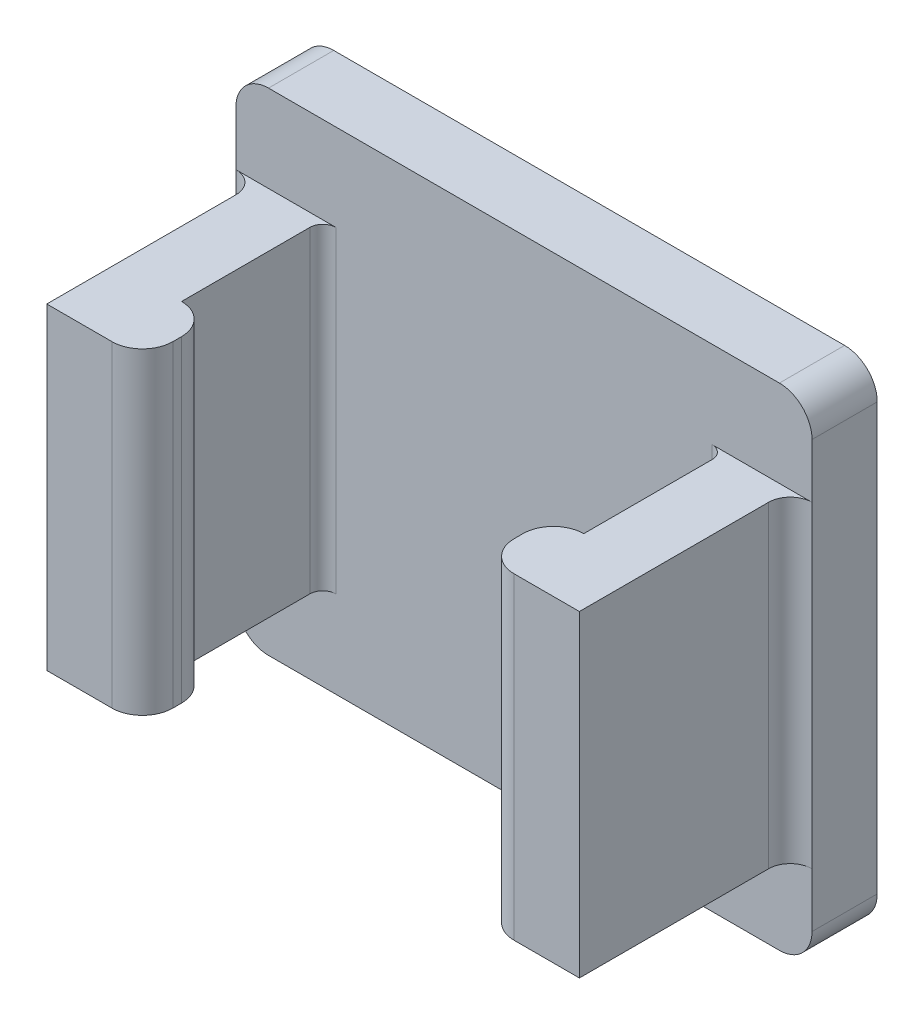
ISO-10303-21;
HEADER;
FILE_DESCRIPTION(('STEP AP214'),'2;1');
FILE_NAME('part.step','',(''),(''),'','','');
FILE_SCHEMA(('AUTOMOTIVE_DESIGN { 1 0 10303 214 1 1 1 1 }'));
ENDSEC;
DATA;
#1=APPLICATION_CONTEXT('core data for automotive mechanical design processes');
#2=APPLICATION_PROTOCOL_DEFINITION('international standard','automotive_design',2000,#1);
#3=PRODUCT_CONTEXT('',#1,'mechanical');
#4=PRODUCT('Part','Part','',(#3));
#5=PRODUCT_RELATED_PRODUCT_CATEGORY('part','',(#4));
#6=PRODUCT_DEFINITION_FORMATION('','',#4);
#7=PRODUCT_DEFINITION_CONTEXT('part definition',#1,'design');
#8=PRODUCT_DEFINITION('design','',#6,#7);
#9=PRODUCT_DEFINITION_SHAPE('','',#8);
#10=(LENGTH_UNIT() NAMED_UNIT(*) SI_UNIT(.MILLI.,.METRE.));
#11=(NAMED_UNIT(*) PLANE_ANGLE_UNIT() SI_UNIT($,.RADIAN.));
#12=(NAMED_UNIT(*) SI_UNIT($,.STERADIAN.) SOLID_ANGLE_UNIT());
#13=UNCERTAINTY_MEASURE_WITH_UNIT(LENGTH_MEASURE(1.E-05),#10,'distance_accuracy_value','');
#14=(GEOMETRIC_REPRESENTATION_CONTEXT(3) GLOBAL_UNCERTAINTY_ASSIGNED_CONTEXT((#13)) GLOBAL_UNIT_ASSIGNED_CONTEXT((#10,
#11,#12)) REPRESENTATION_CONTEXT('',''));
#15=CARTESIAN_POINT('',(0.,0.,0.));
#16=DIRECTION('',(0.,0.,1.));
#17=DIRECTION('',(1.,0.,0.));
#18=AXIS2_PLACEMENT_3D('',#15,#16,#17);
#19=CARTESIAN_POINT('',(-6.125,-5.65,2.5));
#20=DIRECTION('',(1.,0.,0.));
#21=DIRECTION('',(0.,0.,-1.));
#22=AXIS2_PLACEMENT_3D('',#19,#20,#21);
#23=PLANE('',#22);
#24=DIRECTION('',(0.,0.,1.));
#25=VECTOR('',#24,1.);
#26=CARTESIAN_POINT('',(-6.125,3.65,6.35));
#27=LINE('',#26,#25);
#28=CARTESIAN_POINT('',(-6.125,3.65,2.));
#29=VERTEX_POINT('',#28);
#30=CARTESIAN_POINT('',(-6.125,3.65,6.35));
#31=VERTEX_POINT('',#30);
#32=EDGE_CURVE('E478',#29,#31,#27,.T.);
#33=ORIENTED_EDGE('',*,*,#32,.F.);
#34=DIRECTION('',(0.,1.,0.));
#35=VECTOR('',#34,1.);
#36=CARTESIAN_POINT('',(-6.125,-3.65,2.));
#37=LINE('',#36,#35);
#38=CARTESIAN_POINT('',(-6.125,-3.65,2.));
#39=VERTEX_POINT('',#38);
#40=EDGE_CURVE('E278',#29,#39,#37,.F.);
#41=ORIENTED_EDGE('',*,*,#40,.T.);
#42=DIRECTION('',(0.,0.,-1.));
#43=VECTOR('',#42,1.);
#44=CARTESIAN_POINT('',(-6.125,-3.65,6.35));
#45=LINE('',#44,#43);
#46=CARTESIAN_POINT('',(-6.125,-3.65,6.35));
#47=VERTEX_POINT('',#46);
#48=EDGE_CURVE('E376',#47,#39,#45,.T.);
#49=ORIENTED_EDGE('',*,*,#48,.F.);
#50=DIRECTION('',(0.,-1.,0.));
#51=VECTOR('',#50,1.);
#52=CARTESIAN_POINT('',(-6.125,5.65,6.35));
#53=LINE('',#52,#51);
#54=EDGE_CURVE('E242',#31,#47,#53,.T.);
#55=ORIENTED_EDGE('',*,*,#54,.F.);
#56=EDGE_LOOP('',(#33,#41,#49,#55));
#57=FACE_BOUND('',#56,.T.);
#58=ADVANCED_FACE('F40',(#57),#23,.F.);
#59=CARTESIAN_POINT('',(6.125,-5.65,2.5));
#60=DIRECTION('',(-1.,0.,0.));
#61=DIRECTION('',(0.,0.,1.));
#62=AXIS2_PLACEMENT_3D('',#59,#60,#61);
#63=PLANE('',#62);
#64=DIRECTION('',(0.,0.,1.));
#65=VECTOR('',#64,1.);
#66=CARTESIAN_POINT('',(6.125,-3.65,6.35));
#67=LINE('',#66,#65);
#68=CARTESIAN_POINT('',(6.125,-3.65,2.));
#69=VERTEX_POINT('',#68);
#70=CARTESIAN_POINT('',(6.125,-3.65,6.35));
#71=VERTEX_POINT('',#70);
#72=EDGE_CURVE('E215',#69,#71,#67,.T.);
#73=ORIENTED_EDGE('',*,*,#72,.F.);
#74=DIRECTION('',(0.,-1.,0.));
#75=VECTOR('',#74,1.);
#76=CARTESIAN_POINT('',(6.125,3.65,2.));
#77=LINE('',#76,#75);
#78=CARTESIAN_POINT('',(6.125,3.65,2.));
#79=VERTEX_POINT('',#78);
#80=EDGE_CURVE('E276',#69,#79,#77,.F.);
#81=ORIENTED_EDGE('',*,*,#80,.T.);
#82=DIRECTION('',(0.,0.,-1.));
#83=VECTOR('',#82,1.);
#84=CARTESIAN_POINT('',(6.125,3.65,6.35));
#85=LINE('',#84,#83);
#86=CARTESIAN_POINT('',(6.125,3.65,6.35));
#87=VERTEX_POINT('',#86);
#88=EDGE_CURVE('E241',#87,#79,#85,.T.);
#89=ORIENTED_EDGE('',*,*,#88,.F.);
#90=DIRECTION('',(0.,1.,0.));
#91=VECTOR('',#90,1.);
#92=CARTESIAN_POINT('',(6.125,5.65,6.35));
#93=LINE('',#92,#91);
#94=EDGE_CURVE('E233',#71,#87,#93,.T.);
#95=ORIENTED_EDGE('',*,*,#94,.F.);
#96=EDGE_LOOP('',(#73,#81,#89,#95));
#97=FACE_BOUND('',#96,.T.);
#98=ADVANCED_FACE('F239',(#97),#63,.F.);
#99=CARTESIAN_POINT('',(4.625,5.65,6.35));
#100=DIRECTION('',(1.,0.,0.));
#101=DIRECTION('',(0.,1.,0.));
#102=AXIS2_PLACEMENT_3D('',#99,#100,#101);
#103=PLANE('',#102);
#104=DIRECTION('',(0.,0.,-1.));
#105=VECTOR('',#104,1.);
#106=CARTESIAN_POINT('',(4.625,-3.65,6.35));
#107=LINE('',#106,#105);
#108=CARTESIAN_POINT('',(4.625,-3.65,4.75));
#109=VERTEX_POINT('',#108);
#110=CARTESIAN_POINT('',(4.625,-3.65,1.8));
#111=VERTEX_POINT('',#110);
#112=EDGE_CURVE('E488',#109,#111,#107,.T.);
#113=ORIENTED_EDGE('',*,*,#112,.F.);
#114=DIRECTION('',(0.,-1.,0.));
#115=VECTOR('',#114,1.);
#116=CARTESIAN_POINT('',(4.625,-5.65,4.75));
#117=LINE('',#116,#115);
#118=CARTESIAN_POINT('',(4.625,3.65,4.75));
#119=VERTEX_POINT('',#118);
#120=EDGE_CURVE('E509',#119,#109,#117,.T.);
#121=ORIENTED_EDGE('',*,*,#120,.F.);
#122=DIRECTION('',(0.,0.,-1.));
#123=VECTOR('',#122,1.);
#124=CARTESIAN_POINT('',(4.625,3.65,6.35));
#125=LINE('',#124,#123);
#126=CARTESIAN_POINT('',(4.625,3.65,1.8));
#127=VERTEX_POINT('',#126);
#128=EDGE_CURVE('E503',#119,#127,#125,.T.);
#129=ORIENTED_EDGE('',*,*,#128,.T.);
#130=DIRECTION('',(0.,1.,0.));
#131=VECTOR('',#130,1.);
#132=CARTESIAN_POINT('',(4.625,-5.65,1.8));
#133=LINE('',#132,#131);
#134=EDGE_CURVE('E266',#127,#111,#133,.F.);
#135=ORIENTED_EDGE('',*,*,#134,.T.);
#136=EDGE_LOOP('',(#113,#121,#129,#135));
#137=FACE_BOUND('',#136,.T.);
#138=ADVANCED_FACE('F411',(#137),#103,.F.);
#139=CARTESIAN_POINT('',(-4.625,5.65,6.35));
#140=DIRECTION('',(-1.,0.,0.));
#141=DIRECTION('',(0.,-1.,0.));
#142=AXIS2_PLACEMENT_3D('',#139,#140,#141);
#143=PLANE('',#142);
#144=DIRECTION('',(0.,0.,1.));
#145=VECTOR('',#144,1.);
#146=CARTESIAN_POINT('',(-4.625,-3.65,6.35));
#147=LINE('',#146,#145);
#148=CARTESIAN_POINT('',(-4.625,-3.65,1.8));
#149=VERTEX_POINT('',#148);
#150=CARTESIAN_POINT('',(-4.625,-3.65,4.75));
#151=VERTEX_POINT('',#150);
#152=EDGE_CURVE('E237',#149,#151,#147,.T.);
#153=ORIENTED_EDGE('',*,*,#152,.F.);
#154=DIRECTION('',(0.,-1.,0.));
#155=VECTOR('',#154,1.);
#156=CARTESIAN_POINT('',(-4.625,5.65,1.8));
#157=LINE('',#156,#155);
#158=CARTESIAN_POINT('',(-4.625,3.65,1.8));
#159=VERTEX_POINT('',#158);
#160=EDGE_CURVE('E269',#149,#159,#157,.F.);
#161=ORIENTED_EDGE('',*,*,#160,.T.);
#162=DIRECTION('',(0.,0.,1.));
#163=VECTOR('',#162,1.);
#164=CARTESIAN_POINT('',(-4.625,3.65,6.35));
#165=LINE('',#164,#163);
#166=CARTESIAN_POINT('',(-4.625,3.65,4.75));
#167=VERTEX_POINT('',#166);
#168=EDGE_CURVE('E494',#159,#167,#165,.T.);
#169=ORIENTED_EDGE('',*,*,#168,.T.);
#170=DIRECTION('',(0.,1.,0.));
#171=VECTOR('',#170,1.);
#172=CARTESIAN_POINT('',(-4.625,5.65,4.75));
#173=LINE('',#172,#171);
#174=EDGE_CURVE('E249',#151,#167,#173,.T.);
#175=ORIENTED_EDGE('',*,*,#174,.F.);
#176=EDGE_LOOP('',(#153,#161,#169,#175));
#177=FACE_BOUND('',#176,.T.);
#178=ADVANCED_FACE('F517',(#177),#143,.F.);
#179=CARTESIAN_POINT('',(0.,0.,6.35));
#180=DIRECTION('',(0.,0.,1.));
#181=DIRECTION('',(1.,0.,0.));
#182=AXIS2_PLACEMENT_3D('',#179,#180,#181);
#183=PLANE('',#182);
#184=DIRECTION('',(-1.,0.,0.));
#185=VECTOR('',#184,1.);
#186=CARTESIAN_POINT('',(-6.125,-3.65,6.35));
#187=LINE('',#186,#185);
#188=CARTESIAN_POINT('',(-4.625,-3.65,6.35));
#189=VERTEX_POINT('',#188);
#190=EDGE_CURVE('E226',#189,#47,#187,.T.);
#191=ORIENTED_EDGE('',*,*,#190,.F.);
#192=DIRECTION('',(0.,-1.,0.));
#193=VECTOR('',#192,1.);
#194=CARTESIAN_POINT('',(-4.625,0.,6.35));
#195=LINE('',#194,#193);
#196=CARTESIAN_POINT('',(-4.625,3.65,6.35));
#197=VERTEX_POINT('',#196);
#198=EDGE_CURVE('E299',#189,#197,#195,.F.);
#199=ORIENTED_EDGE('',*,*,#198,.T.);
#200=DIRECTION('',(1.,0.,0.));
#201=VECTOR('',#200,1.);
#202=CARTESIAN_POINT('',(-6.125,3.65,6.35));
#203=LINE('',#202,#201);
#204=EDGE_CURVE('E485',#31,#197,#203,.T.);
#205=ORIENTED_EDGE('',*,*,#204,.F.);
#206=ORIENTED_EDGE('',*,*,#54,.T.);
#207=EDGE_LOOP('',(#191,#199,#205,#206));
#208=FACE_BOUND('',#207,.T.);
#209=ADVANCED_FACE('F556',(#208),#183,.T.);
#210=CARTESIAN_POINT('',(0.,0.,6.35));
#211=DIRECTION('',(0.,0.,-1.));
#212=DIRECTION('',(-1.,0.,0.));
#213=AXIS2_PLACEMENT_3D('',#210,#211,#212);
#214=PLANE('',#213);
#215=CARTESIAN_POINT('',(4.625,3.65,6.35));
#216=VERTEX_POINT('',#215);
#217=EDGE_CURVE('E482',#216,#87,#203,.T.);
#218=ORIENTED_EDGE('',*,*,#217,.F.);
#219=DIRECTION('',(0.,1.,0.));
#220=VECTOR('',#219,1.);
#221=CARTESIAN_POINT('',(4.625,-3.65,6.35));
#222=LINE('',#221,#220);
#223=CARTESIAN_POINT('',(4.625,-3.65,6.35));
#224=VERTEX_POINT('',#223);
#225=EDGE_CURVE('E236',#216,#224,#222,.F.);
#226=ORIENTED_EDGE('',*,*,#225,.T.);
#227=EDGE_CURVE('E219',#71,#224,#187,.T.);
#228=ORIENTED_EDGE('',*,*,#227,.F.);
#229=ORIENTED_EDGE('',*,*,#94,.T.);
#230=EDGE_LOOP('',(#218,#226,#228,#229));
#231=FACE_BOUND('',#230,.T.);
#232=ADVANCED_FACE('F232',(#231),#214,.F.);
#233=CARTESIAN_POINT('',(-3.925,0.,0.));
#234=DIRECTION('',(1.,0.,0.));
#235=DIRECTION('',(0.,1.,0.));
#236=AXIS2_PLACEMENT_3D('',#233,#234,#235);
#237=PLANE('',#236);
#238=DIRECTION('',(0.,0.,-1.));
#239=VECTOR('',#238,1.);
#240=CARTESIAN_POINT('',(-3.925,3.65,0.));
#241=LINE('',#240,#239);
#242=CARTESIAN_POINT('',(-3.925,3.65,5.65));
#243=VERTEX_POINT('',#242);
#244=CARTESIAN_POINT('',(-3.925,3.65,5.45));
#245=VERTEX_POINT('',#244);
#246=EDGE_CURVE('E497',#243,#245,#241,.T.);
#247=ORIENTED_EDGE('',*,*,#246,.F.);
#248=DIRECTION('',(0.,-1.,0.));
#249=VECTOR('',#248,1.);
#250=CARTESIAN_POINT('',(-3.925,0.,5.65));
#251=LINE('',#250,#249);
#252=CARTESIAN_POINT('',(-3.925,-3.65,5.65));
#253=VERTEX_POINT('',#252);
#254=EDGE_CURVE('E292',#243,#253,#251,.T.);
#255=ORIENTED_EDGE('',*,*,#254,.T.);
#256=DIRECTION('',(0.,0.,-1.));
#257=VECTOR('',#256,1.);
#258=CARTESIAN_POINT('',(-3.925,-3.65,0.));
#259=LINE('',#258,#257);
#260=CARTESIAN_POINT('',(-3.925,-3.65,5.45));
#261=VERTEX_POINT('',#260);
#262=EDGE_CURVE('E521',#253,#261,#259,.T.);
#263=ORIENTED_EDGE('',*,*,#262,.T.);
#264=DIRECTION('',(0.,1.,0.));
#265=VECTOR('',#264,1.);
#266=CARTESIAN_POINT('',(-3.925,3.65,5.45));
#267=LINE('',#266,#265);
#268=EDGE_CURVE('E289',#261,#245,#267,.T.);
#269=ORIENTED_EDGE('',*,*,#268,.T.);
#270=EDGE_LOOP('',(#247,#255,#263,#269));
#271=FACE_BOUND('',#270,.T.);
#272=ADVANCED_FACE('F542',(#271),#237,.T.);
#273=CARTESIAN_POINT('',(3.925,0.,0.));
#274=DIRECTION('',(-1.,0.,0.));
#275=DIRECTION('',(0.,-1.,0.));
#276=AXIS2_PLACEMENT_3D('',#273,#274,#275);
#277=PLANE('',#276);
#278=DIRECTION('',(0.,0.,1.));
#279=VECTOR('',#278,1.);
#280=CARTESIAN_POINT('',(3.925,3.65,0.));
#281=LINE('',#280,#279);
#282=CARTESIAN_POINT('',(3.925,3.65,5.45));
#283=VERTEX_POINT('',#282);
#284=CARTESIAN_POINT('',(3.925,3.65,5.65));
#285=VERTEX_POINT('',#284);
#286=EDGE_CURVE('E506',#283,#285,#281,.T.);
#287=ORIENTED_EDGE('',*,*,#286,.F.);
#288=DIRECTION('',(0.,-1.,0.));
#289=VECTOR('',#288,1.);
#290=CARTESIAN_POINT('',(3.925,-3.65,5.45));
#291=LINE('',#290,#289);
#292=CARTESIAN_POINT('',(3.925,-3.65,5.45));
#293=VERTEX_POINT('',#292);
#294=EDGE_CURVE('E308',#283,#293,#291,.T.);
#295=ORIENTED_EDGE('',*,*,#294,.T.);
#296=DIRECTION('',(0.,0.,1.));
#297=VECTOR('',#296,1.);
#298=CARTESIAN_POINT('',(3.925,-3.65,0.));
#299=LINE('',#298,#297);
#300=CARTESIAN_POINT('',(3.925,-3.65,5.65));
#301=VERTEX_POINT('',#300);
#302=EDGE_CURVE('E483',#293,#301,#299,.T.);
#303=ORIENTED_EDGE('',*,*,#302,.T.);
#304=DIRECTION('',(0.,1.,0.));
#305=VECTOR('',#304,1.);
#306=CARTESIAN_POINT('',(3.925,3.65,5.65));
#307=LINE('',#306,#305);
#308=EDGE_CURVE('E305',#301,#285,#307,.T.);
#309=ORIENTED_EDGE('',*,*,#308,.T.);
#310=EDGE_LOOP('',(#287,#295,#303,#309));
#311=FACE_BOUND('',#310,.T.);
#312=ADVANCED_FACE('F424',(#311),#277,.T.);
#313=CARTESIAN_POINT('',(4.325,0.,1.8));
#314=DIRECTION('',(0.,-1.,0.));
#315=DIRECTION('',(1.,0.,0.));
#316=AXIS2_PLACEMENT_3D('',#313,#314,#315);
#317=CYLINDRICAL_SURFACE('',#316,0.3);
#318=CARTESIAN_POINT('',(4.325,-3.65,1.8));
#319=DIRECTION('',(0.,-1.,0.));
#320=DIRECTION('',(0.,0.,-1.));
#321=AXIS2_PLACEMENT_3D('',#318,#319,#320);
#322=CIRCLE('',#321,0.3);
#323=CARTESIAN_POINT('',(4.325,-3.65,1.5));
#324=VERTEX_POINT('',#323);
#325=EDGE_CURVE('E523',#111,#324,#322,.F.);
#326=ORIENTED_EDGE('',*,*,#325,.F.);
#327=ORIENTED_EDGE('',*,*,#134,.F.);
#328=CARTESIAN_POINT('',(4.325,3.65,1.8));
#329=DIRECTION('',(0.,-1.,0.));
#330=DIRECTION('',(0.,0.,-1.));
#331=AXIS2_PLACEMENT_3D('',#328,#329,#330);
#332=CIRCLE('',#331,0.3);
#333=CARTESIAN_POINT('',(4.325,3.65,1.5));
#334=VERTEX_POINT('',#333);
#335=EDGE_CURVE('E500',#127,#334,#332,.F.);
#336=ORIENTED_EDGE('',*,*,#335,.T.);
#337=DIRECTION('',(0.,1.,0.));
#338=VECTOR('',#337,1.);
#339=CARTESIAN_POINT('',(4.325,5.65,1.5));
#340=LINE('',#339,#338);
#341=EDGE_CURVE('E264',#324,#334,#340,.T.);
#342=ORIENTED_EDGE('',*,*,#341,.F.);
#343=EDGE_LOOP('',(#326,#327,#336,#342));
#344=FACE_BOUND('',#343,.T.);
#345=ADVANCED_FACE('F421',(#344),#317,.F.);
#346=CARTESIAN_POINT('',(-4.325,0.,1.8));
#347=DIRECTION('',(0.,1.,0.));
#348=DIRECTION('',(-1.,0.,0.));
#349=AXIS2_PLACEMENT_3D('',#346,#347,#348);
#350=CYLINDRICAL_SURFACE('',#349,0.3);
#351=CARTESIAN_POINT('',(-4.325,-3.65,1.8));
#352=DIRECTION('',(0.,-1.,0.));
#353=DIRECTION('',(0.,0.,-1.));
#354=AXIS2_PLACEMENT_3D('',#351,#352,#353);
#355=CIRCLE('',#354,0.3);
#356=CARTESIAN_POINT('',(-4.325,-3.65,1.5));
#357=VERTEX_POINT('',#356);
#358=EDGE_CURVE('E274',#357,#149,#355,.F.);
#359=ORIENTED_EDGE('',*,*,#358,.F.);
#360=DIRECTION('',(0.,-1.,0.));
#361=VECTOR('',#360,1.);
#362=CARTESIAN_POINT('',(-4.325,-5.65,1.5));
#363=LINE('',#362,#361);
#364=CARTESIAN_POINT('',(-4.325,3.65,1.5));
#365=VERTEX_POINT('',#364);
#366=EDGE_CURVE('E261',#365,#357,#363,.T.);
#367=ORIENTED_EDGE('',*,*,#366,.F.);
#368=CARTESIAN_POINT('',(-4.325,3.65,1.8));
#369=DIRECTION('',(0.,-1.,0.));
#370=DIRECTION('',(0.,0.,-1.));
#371=AXIS2_PLACEMENT_3D('',#368,#369,#370);
#372=CIRCLE('',#371,0.3);
#373=EDGE_CURVE('E271',#365,#159,#372,.F.);
#374=ORIENTED_EDGE('',*,*,#373,.T.);
#375=ORIENTED_EDGE('',*,*,#160,.F.);
#376=EDGE_LOOP('',(#359,#367,#374,#375));
#377=FACE_BOUND('',#376,.T.);
#378=ADVANCED_FACE('F419',(#377),#350,.F.);
#379=CARTESIAN_POINT('',(-6.125,5.65,2.5));
#380=DIRECTION('',(0.,-1.,0.));
#381=DIRECTION('',(0.,0.,-1.));
#382=AXIS2_PLACEMENT_3D('',#379,#380,#381);
#383=PLANE('',#382);
#384=DIRECTION('',(-1.,0.,0.));
#385=VECTOR('',#384,1.);
#386=CARTESIAN_POINT('',(-6.125,5.65,0.));
#387=LINE('',#386,#385);
#388=CARTESIAN_POINT('',(5.875,5.65,0.));
#389=VERTEX_POINT('',#388);
#390=CARTESIAN_POINT('',(-5.875,5.65,0.));
#391=VERTEX_POINT('',#390);
#392=EDGE_CURVE('E246',#389,#391,#387,.T.);
#393=ORIENTED_EDGE('',*,*,#392,.T.);
#394=DIRECTION('',(0.,0.,-1.));
#395=VECTOR('',#394,1.);
#396=CARTESIAN_POINT('',(-5.875,5.65,2.5));
#397=LINE('',#396,#395);
#398=CARTESIAN_POINT('',(-5.875,5.65,1.5));
#399=VERTEX_POINT('',#398);
#400=EDGE_CURVE('E11',#391,#399,#397,.F.);
#401=ORIENTED_EDGE('',*,*,#400,.T.);
#402=DIRECTION('',(1.,0.,0.));
#403=VECTOR('',#402,1.);
#404=CARTESIAN_POINT('',(-6.125,5.65,1.5));
#405=LINE('',#404,#403);
#406=CARTESIAN_POINT('',(5.875,5.65,1.5));
#407=VERTEX_POINT('',#406);
#408=EDGE_CURVE('E243',#399,#407,#405,.T.);
#409=ORIENTED_EDGE('',*,*,#408,.T.);
#410=DIRECTION('',(0.,0.,1.));
#411=VECTOR('',#410,1.);
#412=CARTESIAN_POINT('',(5.875,5.65,0.));
#413=LINE('',#412,#411);
#414=EDGE_CURVE('E48',#407,#389,#413,.F.);
#415=ORIENTED_EDGE('',*,*,#414,.T.);
#416=EDGE_LOOP('',(#393,#401,#409,#415));
#417=FACE_BOUND('',#416,.T.);
#418=ADVANCED_FACE('F351',(#417),#383,.F.);
#419=CARTESIAN_POINT('',(-6.125,-5.65,2.5));
#420=DIRECTION('',(0.,1.,0.));
#421=DIRECTION('',(0.,0.,1.));
#422=AXIS2_PLACEMENT_3D('',#419,#420,#421);
#423=PLANE('',#422);
#424=DIRECTION('',(1.,0.,0.));
#425=VECTOR('',#424,1.);
#426=CARTESIAN_POINT('',(-6.125,-5.65,0.));
#427=LINE('',#426,#425);
#428=CARTESIAN_POINT('',(-5.875,-5.65,0.));
#429=VERTEX_POINT('',#428);
#430=CARTESIAN_POINT('',(5.875,-5.65,0.));
#431=VERTEX_POINT('',#430);
#432=EDGE_CURVE('E255',#429,#431,#427,.T.);
#433=ORIENTED_EDGE('',*,*,#432,.T.);
#434=DIRECTION('',(0.,0.,-1.));
#435=VECTOR('',#434,1.);
#436=CARTESIAN_POINT('',(5.875,-5.65,1.5));
#437=LINE('',#436,#435);
#438=CARTESIAN_POINT('',(5.875,-5.65,1.5));
#439=VERTEX_POINT('',#438);
#440=EDGE_CURVE('E336',#431,#439,#437,.F.);
#441=ORIENTED_EDGE('',*,*,#440,.T.);
#442=DIRECTION('',(-1.,0.,0.));
#443=VECTOR('',#442,1.);
#444=CARTESIAN_POINT('',(-6.125,-5.65,1.5));
#445=LINE('',#444,#443);
#446=CARTESIAN_POINT('',(-5.875,-5.65,1.5));
#447=VERTEX_POINT('',#446);
#448=EDGE_CURVE('E258',#439,#447,#445,.T.);
#449=ORIENTED_EDGE('',*,*,#448,.T.);
#450=DIRECTION('',(0.,0.,1.));
#451=VECTOR('',#450,1.);
#452=CARTESIAN_POINT('',(-5.875,-5.65,2.5));
#453=LINE('',#452,#451);
#454=EDGE_CURVE('E334',#447,#429,#453,.F.);
#455=ORIENTED_EDGE('',*,*,#454,.T.);
#456=EDGE_LOOP('',(#433,#441,#449,#455));
#457=FACE_BOUND('',#456,.T.);
#458=ADVANCED_FACE('F416',(#457),#423,.F.);
#459=CARTESIAN_POINT('',(0.,0.,0.));
#460=DIRECTION('',(0.,0.,-1.));
#461=DIRECTION('',(-1.,0.,0.));
#462=AXIS2_PLACEMENT_3D('',#459,#460,#461);
#463=PLANE('',#462);
#464=DIRECTION('',(0.,1.,0.));
#465=VECTOR('',#464,1.);
#466=CARTESIAN_POINT('',(6.625,5.65,0.));
#467=LINE('',#466,#465);
#468=CARTESIAN_POINT('',(6.625,-4.9,0.));
#469=VERTEX_POINT('',#468);
#470=CARTESIAN_POINT('',(6.625,4.9,0.));
#471=VERTEX_POINT('',#470);
#472=EDGE_CURVE('E368',#469,#471,#467,.T.);
#473=ORIENTED_EDGE('',*,*,#472,.F.);
#474=CARTESIAN_POINT('',(5.875,-4.9,0.));
#475=DIRECTION('',(0.,0.,-1.));
#476=DIRECTION('',(-1.,0.,0.));
#477=AXIS2_PLACEMENT_3D('',#474,#475,#476);
#478=CIRCLE('',#477,0.75);
#479=EDGE_CURVE('E332',#469,#431,#478,.T.);
#480=ORIENTED_EDGE('',*,*,#479,.T.);
#481=ORIENTED_EDGE('',*,*,#432,.F.);
#482=CARTESIAN_POINT('',(-5.875,-4.9,0.));
#483=DIRECTION('',(0.,0.,-1.));
#484=DIRECTION('',(-1.,0.,0.));
#485=AXIS2_PLACEMENT_3D('',#482,#483,#484);
#486=CIRCLE('',#485,0.75);
#487=CARTESIAN_POINT('',(-6.625,-4.9,0.));
#488=VERTEX_POINT('',#487);
#489=EDGE_CURVE('E330',#429,#488,#486,.T.);
#490=ORIENTED_EDGE('',*,*,#489,.T.);
#491=DIRECTION('',(0.,-1.,0.));
#492=VECTOR('',#491,1.);
#493=CARTESIAN_POINT('',(-6.625,5.65,0.));
#494=LINE('',#493,#492);
#495=CARTESIAN_POINT('',(-6.625,4.9,0.));
#496=VERTEX_POINT('',#495);
#497=EDGE_CURVE('E379',#496,#488,#494,.T.);
#498=ORIENTED_EDGE('',*,*,#497,.F.);
#499=CARTESIAN_POINT('',(-5.875,4.9,0.));
#500=DIRECTION('',(0.,0.,-1.));
#501=DIRECTION('',(-1.,0.,0.));
#502=AXIS2_PLACEMENT_3D('',#499,#500,#501);
#503=CIRCLE('',#502,0.75);
#504=EDGE_CURVE('E328',#496,#391,#503,.T.);
#505=ORIENTED_EDGE('',*,*,#504,.T.);
#506=ORIENTED_EDGE('',*,*,#392,.F.);
#507=CARTESIAN_POINT('',(5.875,4.9,0.));
#508=DIRECTION('',(0.,0.,-1.));
#509=DIRECTION('',(-1.,0.,0.));
#510=AXIS2_PLACEMENT_3D('',#507,#508,#509);
#511=CIRCLE('',#510,0.75);
#512=EDGE_CURVE('E326',#389,#471,#511,.T.);
#513=ORIENTED_EDGE('',*,*,#512,.T.);
#514=EDGE_LOOP('',(#473,#480,#481,#490,#498,#505,#506,#513));
#515=FACE_BOUND('',#514,.T.);
#516=ADVANCED_FACE('F357',(#515),#463,.T.);
#517=CARTESIAN_POINT('',(0.,0.,1.5));
#518=DIRECTION('',(0.,0.,-1.));
#519=DIRECTION('',(-1.,0.,0.));
#520=AXIS2_PLACEMENT_3D('',#517,#518,#519);
#521=PLANE('',#520);
#522=ORIENTED_EDGE('',*,*,#448,.F.);
#523=CARTESIAN_POINT('',(5.875,-4.9,1.5));
#524=DIRECTION('',(0.,0.,-1.));
#525=DIRECTION('',(-1.,0.,0.));
#526=AXIS2_PLACEMENT_3D('',#523,#524,#525);
#527=CIRCLE('',#526,0.75);
#528=CARTESIAN_POINT('',(6.625,-4.9,1.5));
#529=VERTEX_POINT('',#528);
#530=EDGE_CURVE('E342',#439,#529,#527,.F.);
#531=ORIENTED_EDGE('',*,*,#530,.T.);
#532=DIRECTION('',(0.,-1.,0.));
#533=VECTOR('',#532,1.);
#534=CARTESIAN_POINT('',(6.625,5.65,1.5));
#535=LINE('',#534,#533);
#536=CARTESIAN_POINT('',(6.625,-3.65,1.5));
#537=VERTEX_POINT('',#536);
#538=EDGE_CURVE('E375',#537,#529,#535,.T.);
#539=ORIENTED_EDGE('',*,*,#538,.F.);
#540=DIRECTION('',(1.,0.,0.));
#541=VECTOR('',#540,1.);
#542=CARTESIAN_POINT('',(-6.125,-3.65,1.5));
#543=LINE('',#542,#541);
#544=EDGE_CURVE('E466',#324,#537,#543,.T.);
#545=ORIENTED_EDGE('',*,*,#544,.F.);
#546=ORIENTED_EDGE('',*,*,#341,.T.);
#547=DIRECTION('',(-1.,0.,0.));
#548=VECTOR('',#547,1.);
#549=CARTESIAN_POINT('',(-6.125,3.65,1.5));
#550=LINE('',#549,#548);
#551=CARTESIAN_POINT('',(6.625,3.65,1.5));
#552=VERTEX_POINT('',#551);
#553=EDGE_CURVE('E372',#552,#334,#550,.T.);
#554=ORIENTED_EDGE('',*,*,#553,.F.);
#555=CARTESIAN_POINT('',(6.625,4.9,1.5));
#556=VERTEX_POINT('',#555);
#557=EDGE_CURVE('E366',#556,#552,#535,.T.);
#558=ORIENTED_EDGE('',*,*,#557,.F.);
#559=CARTESIAN_POINT('',(5.875,4.9,1.5));
#560=DIRECTION('',(0.,0.,-1.));
#561=DIRECTION('',(-1.,0.,0.));
#562=AXIS2_PLACEMENT_3D('',#559,#560,#561);
#563=CIRCLE('',#562,0.75);
#564=EDGE_CURVE('E338',#556,#407,#563,.F.);
#565=ORIENTED_EDGE('',*,*,#564,.T.);
#566=ORIENTED_EDGE('',*,*,#408,.F.);
#567=CARTESIAN_POINT('',(-5.875,4.9,1.5));
#568=DIRECTION('',(0.,0.,-1.));
#569=DIRECTION('',(-1.,0.,0.));
#570=AXIS2_PLACEMENT_3D('',#567,#568,#569);
#571=CIRCLE('',#570,0.75);
#572=CARTESIAN_POINT('',(-6.625,4.9,1.5));
#573=VERTEX_POINT('',#572);
#574=EDGE_CURVE('E63',#399,#573,#571,.F.);
#575=ORIENTED_EDGE('',*,*,#574,.T.);
#576=DIRECTION('',(0.,1.,0.));
#577=VECTOR('',#576,1.);
#578=CARTESIAN_POINT('',(-6.625,5.65,1.5));
#579=LINE('',#578,#577);
#580=CARTESIAN_POINT('',(-6.625,3.65,1.5));
#581=VERTEX_POINT('',#580);
#582=EDGE_CURVE('E387',#581,#573,#579,.T.);
#583=ORIENTED_EDGE('',*,*,#582,.F.);
#584=EDGE_CURVE('E480',#365,#581,#550,.T.);
#585=ORIENTED_EDGE('',*,*,#584,.F.);
#586=ORIENTED_EDGE('',*,*,#366,.T.);
#587=CARTESIAN_POINT('',(-6.625,-3.65,1.5));
#588=VERTEX_POINT('',#587);
#589=EDGE_CURVE('E227',#588,#357,#543,.T.);
#590=ORIENTED_EDGE('',*,*,#589,.F.);
#591=CARTESIAN_POINT('',(-6.625,-4.9,1.5));
#592=VERTEX_POINT('',#591);
#593=EDGE_CURVE('E383',#592,#588,#579,.T.);
#594=ORIENTED_EDGE('',*,*,#593,.F.);
#595=CARTESIAN_POINT('',(-5.875,-4.9,1.5));
#596=DIRECTION('',(0.,0.,-1.));
#597=DIRECTION('',(-1.,0.,0.));
#598=AXIS2_PLACEMENT_3D('',#595,#596,#597);
#599=CIRCLE('',#598,0.75);
#600=EDGE_CURVE('E55',#592,#447,#599,.F.);
#601=ORIENTED_EDGE('',*,*,#600,.T.);
#602=EDGE_LOOP('',(#522,#531,#539,#545,#546,#554,#558,#565,#566,#575,#583,#585,#586,#590,#594,#601));
#603=FACE_BOUND('',#602,.T.);
#604=ADVANCED_FACE('F370',(#603),#521,.F.);
#605=CARTESIAN_POINT('',(0.,3.65,0.));
#606=DIRECTION('',(0.,-1.,0.));
#607=DIRECTION('',(0.,0.,-1.));
#608=AXIS2_PLACEMENT_3D('',#605,#606,#607);
#609=PLANE('',#608);
#610=ORIENTED_EDGE('',*,*,#204,.T.);
#611=CARTESIAN_POINT('',(-4.625,3.65,5.65));
#612=DIRECTION('',(0.,-1.,0.));
#613=DIRECTION('',(0.,0.,-1.));
#614=AXIS2_PLACEMENT_3D('',#611,#612,#613);
#615=CIRCLE('',#614,0.7);
#616=EDGE_CURVE('E303',#197,#243,#615,.F.);
#617=ORIENTED_EDGE('',*,*,#616,.T.);
#618=ORIENTED_EDGE('',*,*,#246,.T.);
#619=CARTESIAN_POINT('',(-4.625,3.65,5.45));
#620=DIRECTION('',(0.,-1.,0.));
#621=DIRECTION('',(0.,0.,-1.));
#622=AXIS2_PLACEMENT_3D('',#619,#620,#621);
#623=CIRCLE('',#622,0.7);
#624=EDGE_CURVE('E301',#245,#167,#623,.F.);
#625=ORIENTED_EDGE('',*,*,#624,.T.);
#626=ORIENTED_EDGE('',*,*,#168,.F.);
#627=ORIENTED_EDGE('',*,*,#373,.F.);
#628=ORIENTED_EDGE('',*,*,#584,.T.);
#629=CARTESIAN_POINT('',(-6.625,3.65,2.));
#630=DIRECTION('',(0.,-1.,0.));
#631=DIRECTION('',(0.,0.,-1.));
#632=AXIS2_PLACEMENT_3D('',#629,#630,#631);
#633=CIRCLE('',#632,0.5);
#634=EDGE_CURVE('E284',#581,#29,#633,.T.);
#635=ORIENTED_EDGE('',*,*,#634,.T.);
#636=ORIENTED_EDGE('',*,*,#32,.T.);
#637=EDGE_LOOP('',(#610,#617,#618,#625,#626,#627,#628,#635,#636));
#638=FACE_BOUND('',#637,.T.);
#639=ADVANCED_FACE('F477',(#638),#609,.F.);
#640=ORIENTED_EDGE('',*,*,#128,.F.);
#641=CARTESIAN_POINT('',(4.625,3.65,5.45));
#642=DIRECTION('',(0.,-1.,0.));
#643=DIRECTION('',(0.,0.,-1.));
#644=AXIS2_PLACEMENT_3D('',#641,#642,#643);
#645=CIRCLE('',#644,0.7);
#646=EDGE_CURVE('E317',#119,#283,#645,.F.);
#647=ORIENTED_EDGE('',*,*,#646,.T.);
#648=ORIENTED_EDGE('',*,*,#286,.T.);
#649=CARTESIAN_POINT('',(4.625,3.65,5.65));
#650=DIRECTION('',(0.,-1.,0.));
#651=DIRECTION('',(0.,0.,-1.));
#652=AXIS2_PLACEMENT_3D('',#649,#650,#651);
#653=CIRCLE('',#652,0.7);
#654=EDGE_CURVE('E315',#285,#216,#653,.F.);
#655=ORIENTED_EDGE('',*,*,#654,.T.);
#656=ORIENTED_EDGE('',*,*,#217,.T.);
#657=ORIENTED_EDGE('',*,*,#88,.T.);
#658=CARTESIAN_POINT('',(6.625,3.65,2.));
#659=DIRECTION('',(0.,-1.,0.));
#660=DIRECTION('',(0.,0.,-1.));
#661=AXIS2_PLACEMENT_3D('',#658,#659,#660);
#662=CIRCLE('',#661,0.5);
#663=EDGE_CURVE('E281',#79,#552,#662,.T.);
#664=ORIENTED_EDGE('',*,*,#663,.T.);
#665=ORIENTED_EDGE('',*,*,#553,.T.);
#666=ORIENTED_EDGE('',*,*,#335,.F.);
#667=EDGE_LOOP('',(#640,#647,#648,#655,#656,#657,#664,#665,#666));
#668=FACE_BOUND('',#667,.T.);
#669=ADVANCED_FACE('F534',(#668),#609,.F.);
#670=CARTESIAN_POINT('',(0.,-3.65,0.));
#671=DIRECTION('',(0.,-1.,0.));
#672=DIRECTION('',(0.,0.,-1.));
#673=AXIS2_PLACEMENT_3D('',#670,#671,#672);
#674=PLANE('',#673);
#675=ORIENTED_EDGE('',*,*,#262,.F.);
#676=CARTESIAN_POINT('',(-4.625,-3.65,5.65));
#677=DIRECTION('',(0.,-1.,0.));
#678=DIRECTION('',(0.,0.,-1.));
#679=AXIS2_PLACEMENT_3D('',#676,#677,#678);
#680=CIRCLE('',#679,0.7);
#681=EDGE_CURVE('E297',#253,#189,#680,.T.);
#682=ORIENTED_EDGE('',*,*,#681,.T.);
#683=ORIENTED_EDGE('',*,*,#190,.T.);
#684=ORIENTED_EDGE('',*,*,#48,.T.);
#685=CARTESIAN_POINT('',(-6.625,-3.65,2.));
#686=DIRECTION('',(0.,-1.,0.));
#687=DIRECTION('',(0.,0.,-1.));
#688=AXIS2_PLACEMENT_3D('',#685,#686,#687);
#689=CIRCLE('',#688,0.5);
#690=EDGE_CURVE('E286',#39,#588,#689,.F.);
#691=ORIENTED_EDGE('',*,*,#690,.T.);
#692=ORIENTED_EDGE('',*,*,#589,.T.);
#693=ORIENTED_EDGE('',*,*,#358,.T.);
#694=ORIENTED_EDGE('',*,*,#152,.T.);
#695=CARTESIAN_POINT('',(-4.625,-3.65,5.45));
#696=DIRECTION('',(0.,-1.,0.));
#697=DIRECTION('',(0.,0.,-1.));
#698=AXIS2_PLACEMENT_3D('',#695,#696,#697);
#699=CIRCLE('',#698,0.7);
#700=EDGE_CURVE('E295',#151,#261,#699,.T.);
#701=ORIENTED_EDGE('',*,*,#700,.T.);
#702=EDGE_LOOP('',(#675,#682,#683,#684,#691,#692,#693,#694,#701));
#703=FACE_BOUND('',#702,.T.);
#704=ADVANCED_FACE('F471',(#703),#674,.T.);
#705=ORIENTED_EDGE('',*,*,#302,.F.);
#706=CARTESIAN_POINT('',(4.625,-3.65,5.45));
#707=DIRECTION('',(0.,-1.,0.));
#708=DIRECTION('',(0.,0.,-1.));
#709=AXIS2_PLACEMENT_3D('',#706,#707,#708);
#710=CIRCLE('',#709,0.7);
#711=EDGE_CURVE('E313',#293,#109,#710,.T.);
#712=ORIENTED_EDGE('',*,*,#711,.T.);
#713=ORIENTED_EDGE('',*,*,#112,.T.);
#714=ORIENTED_EDGE('',*,*,#325,.T.);
#715=ORIENTED_EDGE('',*,*,#544,.T.);
#716=CARTESIAN_POINT('',(6.625,-3.65,2.));
#717=DIRECTION('',(0.,-1.,0.));
#718=DIRECTION('',(0.,0.,-1.));
#719=AXIS2_PLACEMENT_3D('',#716,#717,#718);
#720=CIRCLE('',#719,0.5);
#721=EDGE_CURVE('E222',#537,#69,#720,.F.);
#722=ORIENTED_EDGE('',*,*,#721,.T.);
#723=ORIENTED_EDGE('',*,*,#72,.T.);
#724=ORIENTED_EDGE('',*,*,#227,.T.);
#725=CARTESIAN_POINT('',(4.625,-3.65,5.65));
#726=DIRECTION('',(0.,-1.,0.));
#727=DIRECTION('',(0.,0.,-1.));
#728=AXIS2_PLACEMENT_3D('',#725,#726,#727);
#729=CIRCLE('',#728,0.7);
#730=EDGE_CURVE('E311',#224,#301,#729,.T.);
#731=ORIENTED_EDGE('',*,*,#730,.T.);
#732=EDGE_LOOP('',(#705,#712,#713,#714,#715,#722,#723,#724,#731));
#733=FACE_BOUND('',#732,.T.);
#734=ADVANCED_FACE('F218',(#733),#674,.T.);
#735=CARTESIAN_POINT('',(6.625,0.,0.));
#736=DIRECTION('',(1.,0.,0.));
#737=DIRECTION('',(0.,0.,-1.));
#738=AXIS2_PLACEMENT_3D('',#735,#736,#737);
#739=PLANE('',#738);
#740=ORIENTED_EDGE('',*,*,#538,.T.);
#741=DIRECTION('',(0.,0.,-1.));
#742=VECTOR('',#741,1.);
#743=CARTESIAN_POINT('',(6.625,-4.9,0.));
#744=LINE('',#743,#742);
#745=EDGE_CURVE('E323',#529,#469,#744,.T.);
#746=ORIENTED_EDGE('',*,*,#745,.T.);
#747=ORIENTED_EDGE('',*,*,#472,.T.);
#748=DIRECTION('',(0.,0.,1.));
#749=VECTOR('',#748,1.);
#750=CARTESIAN_POINT('',(6.625,4.9,1.5));
#751=LINE('',#750,#749);
#752=EDGE_CURVE('E320',#471,#556,#751,.T.);
#753=ORIENTED_EDGE('',*,*,#752,.T.);
#754=ORIENTED_EDGE('',*,*,#557,.T.);
#755=EDGE_CURVE('E373',#552,#537,#535,.T.);
#756=ORIENTED_EDGE('',*,*,#755,.T.);
#757=EDGE_LOOP('',(#740,#746,#747,#753,#754,#756));
#758=FACE_BOUND('',#757,.T.);
#759=ADVANCED_FACE('F364',(#758),#739,.T.);
#760=CARTESIAN_POINT('',(-6.625,0.,0.));
#761=DIRECTION('',(1.,0.,0.));
#762=DIRECTION('',(0.,0.,-1.));
#763=AXIS2_PLACEMENT_3D('',#760,#761,#762);
#764=PLANE('',#763);
#765=ORIENTED_EDGE('',*,*,#497,.T.);
#766=DIRECTION('',(0.,0.,1.));
#767=VECTOR('',#766,1.);
#768=CARTESIAN_POINT('',(-6.625,-4.9,0.));
#769=LINE('',#768,#767);
#770=EDGE_CURVE('E347',#488,#592,#769,.T.);
#771=ORIENTED_EDGE('',*,*,#770,.T.);
#772=ORIENTED_EDGE('',*,*,#593,.T.);
#773=EDGE_CURVE('E385',#588,#581,#579,.T.);
#774=ORIENTED_EDGE('',*,*,#773,.T.);
#775=ORIENTED_EDGE('',*,*,#582,.T.);
#776=DIRECTION('',(0.,0.,-1.));
#777=VECTOR('',#776,1.);
#778=CARTESIAN_POINT('',(-6.625,4.9,0.));
#779=LINE('',#778,#777);
#780=EDGE_CURVE('E344',#573,#496,#779,.T.);
#781=ORIENTED_EDGE('',*,*,#780,.T.);
#782=EDGE_LOOP('',(#765,#771,#772,#774,#775,#781));
#783=FACE_BOUND('',#782,.T.);
#784=ADVANCED_FACE('F392',(#783),#764,.F.);
#785=CARTESIAN_POINT('',(6.625,0.,2.));
#786=DIRECTION('',(0.,1.,0.));
#787=DIRECTION('',(0.,0.,1.));
#788=AXIS2_PLACEMENT_3D('',#785,#786,#787);
#789=CYLINDRICAL_SURFACE('',#788,0.5);
#790=ORIENTED_EDGE('',*,*,#663,.F.);
#791=ORIENTED_EDGE('',*,*,#80,.F.);
#792=ORIENTED_EDGE('',*,*,#721,.F.);
#793=ORIENTED_EDGE('',*,*,#755,.F.);
#794=EDGE_LOOP('',(#790,#791,#792,#793));
#795=FACE_BOUND('',#794,.T.);
#796=ADVANCED_FACE('F429',(#795),#789,.F.);
#797=CARTESIAN_POINT('',(-6.625,0.,2.));
#798=DIRECTION('',(0.,-1.,0.));
#799=DIRECTION('',(0.,0.,-1.));
#800=AXIS2_PLACEMENT_3D('',#797,#798,#799);
#801=CYLINDRICAL_SURFACE('',#800,0.5);
#802=ORIENTED_EDGE('',*,*,#690,.F.);
#803=ORIENTED_EDGE('',*,*,#40,.F.);
#804=ORIENTED_EDGE('',*,*,#634,.F.);
#805=ORIENTED_EDGE('',*,*,#773,.F.);
#806=EDGE_LOOP('',(#802,#803,#804,#805));
#807=FACE_BOUND('',#806,.T.);
#808=ADVANCED_FACE('F432',(#807),#801,.F.);
#809=CARTESIAN_POINT('',(-4.625,0.,5.65));
#810=DIRECTION('',(0.,-1.,0.));
#811=DIRECTION('',(1.,0.,0.));
#812=AXIS2_PLACEMENT_3D('',#809,#810,#811);
#813=CYLINDRICAL_SURFACE('',#812,0.7);
#814=ORIENTED_EDGE('',*,*,#616,.F.);
#815=ORIENTED_EDGE('',*,*,#198,.F.);
#816=ORIENTED_EDGE('',*,*,#681,.F.);
#817=ORIENTED_EDGE('',*,*,#254,.F.);
#818=EDGE_LOOP('',(#814,#815,#816,#817));
#819=FACE_BOUND('',#818,.T.);
#820=ADVANCED_FACE('F436',(#819),#813,.T.);
#821=CARTESIAN_POINT('',(-4.625,0.,5.45));
#822=DIRECTION('',(0.,-1.,0.));
#823=DIRECTION('',(1.,0.,0.));
#824=AXIS2_PLACEMENT_3D('',#821,#822,#823);
#825=CYLINDRICAL_SURFACE('',#824,0.7);
#826=ORIENTED_EDGE('',*,*,#700,.F.);
#827=ORIENTED_EDGE('',*,*,#174,.T.);
#828=ORIENTED_EDGE('',*,*,#624,.F.);
#829=ORIENTED_EDGE('',*,*,#268,.F.);
#830=EDGE_LOOP('',(#826,#827,#828,#829));
#831=FACE_BOUND('',#830,.T.);
#832=ADVANCED_FACE('F440',(#831),#825,.T.);
#833=CARTESIAN_POINT('',(4.625,0.,5.45));
#834=DIRECTION('',(0.,1.,0.));
#835=DIRECTION('',(-1.,0.,0.));
#836=AXIS2_PLACEMENT_3D('',#833,#834,#835);
#837=CYLINDRICAL_SURFACE('',#836,0.7);
#838=ORIENTED_EDGE('',*,*,#646,.F.);
#839=ORIENTED_EDGE('',*,*,#120,.T.);
#840=ORIENTED_EDGE('',*,*,#711,.F.);
#841=ORIENTED_EDGE('',*,*,#294,.F.);
#842=EDGE_LOOP('',(#838,#839,#840,#841));
#843=FACE_BOUND('',#842,.T.);
#844=ADVANCED_FACE('F444',(#843),#837,.T.);
#845=CARTESIAN_POINT('',(4.625,0.,5.65));
#846=DIRECTION('',(0.,-1.,0.));
#847=DIRECTION('',(1.,0.,0.));
#848=AXIS2_PLACEMENT_3D('',#845,#846,#847);
#849=CYLINDRICAL_SURFACE('',#848,0.7);
#850=ORIENTED_EDGE('',*,*,#730,.F.);
#851=ORIENTED_EDGE('',*,*,#225,.F.);
#852=ORIENTED_EDGE('',*,*,#654,.F.);
#853=ORIENTED_EDGE('',*,*,#308,.F.);
#854=EDGE_LOOP('',(#850,#851,#852,#853));
#855=FACE_BOUND('',#854,.T.);
#856=ADVANCED_FACE('F448',(#855),#849,.T.);
#857=CARTESIAN_POINT('',(5.875,-4.9,0.));
#858=DIRECTION('',(0.,0.,1.));
#859=DIRECTION('',(1.,0.,0.));
#860=AXIS2_PLACEMENT_3D('',#857,#858,#859);
#861=CYLINDRICAL_SURFACE('',#860,0.75);
#862=ORIENTED_EDGE('',*,*,#530,.F.);
#863=ORIENTED_EDGE('',*,*,#440,.F.);
#864=ORIENTED_EDGE('',*,*,#479,.F.);
#865=ORIENTED_EDGE('',*,*,#745,.F.);
#866=EDGE_LOOP('',(#862,#863,#864,#865));
#867=FACE_BOUND('',#866,.T.);
#868=ADVANCED_FACE('F403',(#867),#861,.T.);
#869=CARTESIAN_POINT('',(-5.875,-4.9,0.));
#870=DIRECTION('',(0.,0.,1.));
#871=DIRECTION('',(1.,0.,0.));
#872=AXIS2_PLACEMENT_3D('',#869,#870,#871);
#873=CYLINDRICAL_SURFACE('',#872,0.75);
#874=ORIENTED_EDGE('',*,*,#489,.F.);
#875=ORIENTED_EDGE('',*,*,#454,.F.);
#876=ORIENTED_EDGE('',*,*,#600,.F.);
#877=ORIENTED_EDGE('',*,*,#770,.F.);
#878=EDGE_LOOP('',(#874,#875,#876,#877));
#879=FACE_BOUND('',#878,.T.);
#880=ADVANCED_FACE('F398',(#879),#873,.T.);
#881=CARTESIAN_POINT('',(-5.875,4.9,0.));
#882=DIRECTION('',(0.,0.,-1.));
#883=DIRECTION('',(-1.,0.,0.));
#884=AXIS2_PLACEMENT_3D('',#881,#882,#883);
#885=CYLINDRICAL_SURFACE('',#884,0.75);
#886=ORIENTED_EDGE('',*,*,#574,.F.);
#887=ORIENTED_EDGE('',*,*,#400,.F.);
#888=ORIENTED_EDGE('',*,*,#504,.F.);
#889=ORIENTED_EDGE('',*,*,#780,.F.);
#890=EDGE_LOOP('',(#886,#887,#888,#889));
#891=FACE_BOUND('',#890,.T.);
#892=ADVANCED_FACE('F396',(#891),#885,.T.);
#893=CARTESIAN_POINT('',(5.875,4.9,0.));
#894=DIRECTION('',(0.,0.,-1.));
#895=DIRECTION('',(-1.,0.,0.));
#896=AXIS2_PLACEMENT_3D('',#893,#894,#895);
#897=CYLINDRICAL_SURFACE('',#896,0.75);
#898=ORIENTED_EDGE('',*,*,#512,.F.);
#899=ORIENTED_EDGE('',*,*,#414,.F.);
#900=ORIENTED_EDGE('',*,*,#564,.F.);
#901=ORIENTED_EDGE('',*,*,#752,.F.);
#902=EDGE_LOOP('',(#898,#899,#900,#901));
#903=FACE_BOUND('',#902,.T.);
#904=ADVANCED_FACE('F42',(#903),#897,.T.);
#905=CLOSED_SHELL('',(#58,#98,#138,#178,#209,#232,#272,#312,#345,#378,#418,#458,#516,#604,#639,
#669,#704,#734,#759,#784,#796,#808,#820,#832,#844,#856,#868,#880,#892,#904));
#906=MANIFOLD_SOLID_BREP('B2',#905);
#907=ADVANCED_BREP_SHAPE_REPRESENTATION('',(#18,#906),#14);
#908=SHAPE_DEFINITION_REPRESENTATION(#9,#907);
ENDSEC;
END-ISO-10303-21;
